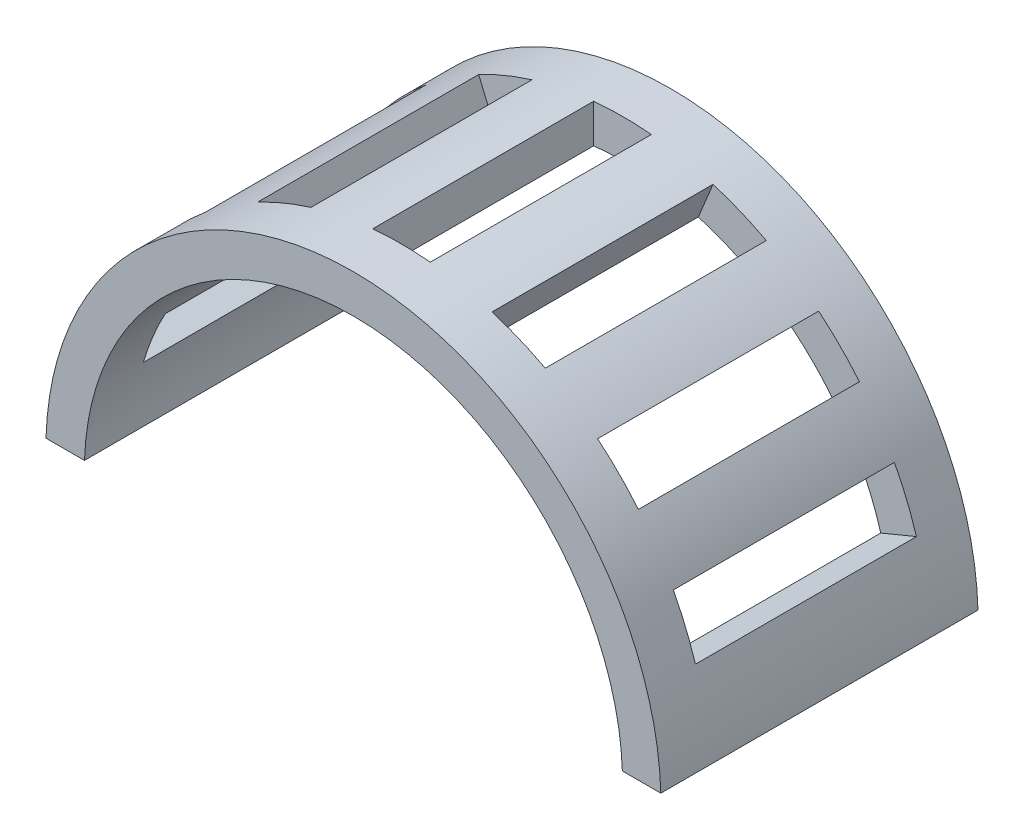
ISO-10303-21;
HEADER;
FILE_DESCRIPTION(('STEP AP214'),'2;1');
FILE_NAME('part.step','',(''),(''),'','','');
FILE_SCHEMA(('AUTOMOTIVE_DESIGN { 1 0 10303 214 1 1 1 1 }'));
ENDSEC;
DATA;
#1=APPLICATION_CONTEXT('core data for automotive mechanical design processes');
#2=APPLICATION_PROTOCOL_DEFINITION('international standard','automotive_design',2000,#1);
#3=PRODUCT_CONTEXT('',#1,'mechanical');
#4=PRODUCT('Part','Part','',(#3));
#5=PRODUCT_RELATED_PRODUCT_CATEGORY('part','',(#4));
#6=PRODUCT_DEFINITION_FORMATION('','',#4);
#7=PRODUCT_DEFINITION_CONTEXT('part definition',#1,'design');
#8=PRODUCT_DEFINITION('design','',#6,#7);
#9=PRODUCT_DEFINITION_SHAPE('','',#8);
#10=(LENGTH_UNIT() NAMED_UNIT(*) SI_UNIT(.MILLI.,.METRE.));
#11=(NAMED_UNIT(*) PLANE_ANGLE_UNIT() SI_UNIT($,.RADIAN.));
#12=(NAMED_UNIT(*) SI_UNIT($,.STERADIAN.) SOLID_ANGLE_UNIT());
#13=UNCERTAINTY_MEASURE_WITH_UNIT(LENGTH_MEASURE(1.E-05),#10,'distance_accuracy_value','');
#14=(GEOMETRIC_REPRESENTATION_CONTEXT(3) GLOBAL_UNCERTAINTY_ASSIGNED_CONTEXT((#13)) GLOBAL_UNIT_ASSIGNED_CONTEXT((#10,
#11,#12)) REPRESENTATION_CONTEXT('',''));
#15=CARTESIAN_POINT('',(0.,0.,0.));
#16=DIRECTION('',(0.,0.,1.));
#17=DIRECTION('',(1.,0.,0.));
#18=AXIS2_PLACEMENT_3D('',#15,#16,#17);
#19=CARTESIAN_POINT('',(0.,0.,16.5));
#20=DIRECTION('',(0.,0.,-1.));
#21=DIRECTION('',(-1.,0.,0.));
#22=AXIS2_PLACEMENT_3D('',#19,#20,#21);
#23=CYLINDRICAL_SURFACE('',#22,16.);
#24=CARTESIAN_POINT('',(0.,0.,0.));
#25=DIRECTION('',(0.,0.,1.));
#26=DIRECTION('',(1.,0.,0.));
#27=AXIS2_PLACEMENT_3D('',#24,#25,#26);
#28=CIRCLE('',#27,16.);
#29=CARTESIAN_POINT('',(15.9921855917195,0.5,0.));
#30=VERTEX_POINT('',#29);
#31=CARTESIAN_POINT('',(-15.9921855917195,0.5,0.));
#32=VERTEX_POINT('',#31);
#33=EDGE_CURVE('E454',#30,#32,#28,.T.);
#34=ORIENTED_EDGE('',*,*,#33,.T.);
#35=DIRECTION('',(0.,0.,-1.));
#36=VECTOR('',#35,1.);
#37=CARTESIAN_POINT('',(-15.9921855917195,0.5,16.5));
#38=LINE('',#37,#36);
#39=CARTESIAN_POINT('',(-15.9921855917195,0.5,16.5));
#40=VERTEX_POINT('',#39);
#41=EDGE_CURVE('E11',#40,#32,#38,.T.);
#42=ORIENTED_EDGE('',*,*,#41,.F.);
#43=CARTESIAN_POINT('',(0.,0.,16.5));
#44=DIRECTION('',(0.,0.,1.));
#45=DIRECTION('',(1.,0.,0.));
#46=AXIS2_PLACEMENT_3D('',#43,#44,#45);
#47=CIRCLE('',#46,16.);
#48=CARTESIAN_POINT('',(15.9921855917195,0.5,16.5));
#49=VERTEX_POINT('',#48);
#50=EDGE_CURVE('E464',#49,#40,#47,.T.);
#51=ORIENTED_EDGE('',*,*,#50,.F.);
#52=DIRECTION('',(0.,0.,-1.));
#53=VECTOR('',#52,1.);
#54=CARTESIAN_POINT('',(15.9921855917195,0.5,16.5));
#55=LINE('',#54,#53);
#56=EDGE_CURVE('E474',#49,#30,#55,.T.);
#57=ORIENTED_EDGE('',*,*,#56,.T.);
#58=EDGE_LOOP('',(#34,#42,#51,#57));
#59=FACE_BOUND('',#58,.T.);
#60=DIRECTION('',(0.,0.,1.));
#61=VECTOR('',#60,1.);
#62=CARTESIAN_POINT('',(-12.3245404978485,10.2032201542891,2.5));
#63=LINE('',#62,#61);
#64=CARTESIAN_POINT('',(-12.3245404978485,10.2032201542891,2.5));
#65=VERTEX_POINT('',#64);
#66=CARTESIAN_POINT('',(-12.3245404978485,10.2032201542891,14.));
#67=VERTEX_POINT('',#66);
#68=EDGE_CURVE('E292',#65,#67,#63,.T.);
#69=ORIENTED_EDGE('',*,*,#68,.F.);
#70=CARTESIAN_POINT('',(0.,0.,2.5));
#71=DIRECTION('',(0.,0.,1.));
#72=DIRECTION('',(0.707106781186556,0.707106781186539,0.));
#73=AXIS2_PLACEMENT_3D('',#70,#71,#72);
#74=CIRCLE('',#73,16.);
#75=CARTESIAN_POINT('',(-10.2032201542888,12.3245404978488,2.5));
#76=VERTEX_POINT('',#75);
#77=EDGE_CURVE('E287',#76,#65,#74,.T.);
#78=ORIENTED_EDGE('',*,*,#77,.F.);
#79=DIRECTION('',(0.,0.,1.));
#80=VECTOR('',#79,1.);
#81=CARTESIAN_POINT('',(-10.2032201542888,12.3245404978488,2.5));
#82=LINE('',#81,#80);
#83=CARTESIAN_POINT('',(-10.2032201542888,12.3245404978488,14.));
#84=VERTEX_POINT('',#83);
#85=EDGE_CURVE('E281',#76,#84,#82,.T.);
#86=ORIENTED_EDGE('',*,*,#85,.T.);
#87=CARTESIAN_POINT('',(0.,0.,14.));
#88=DIRECTION('',(0.,0.,1.));
#89=DIRECTION('',(0.707106781186556,0.707106781186539,0.));
#90=AXIS2_PLACEMENT_3D('',#87,#88,#89);
#91=CIRCLE('',#90,16.);
#92=EDGE_CURVE('E263',#84,#67,#91,.T.);
#93=ORIENTED_EDGE('',*,*,#92,.T.);
#94=EDGE_LOOP('',(#69,#78,#86,#93));
#95=FACE_BOUND('',#94,.T.);
#96=DIRECTION('',(0.,0.,1.));
#97=VECTOR('',#96,1.);
#98=CARTESIAN_POINT('',(14.1429437262935,7.48178740374881,2.5));
#99=LINE('',#98,#97);
#100=CARTESIAN_POINT('',(14.1429437262935,7.48178740374881,2.5));
#101=VERTEX_POINT('',#100);
#102=CARTESIAN_POINT('',(14.1429437262935,7.48178740374881,14.));
#103=VERTEX_POINT('',#102);
#104=EDGE_CURVE('E354',#101,#103,#99,.T.);
#105=ORIENTED_EDGE('',*,*,#104,.F.);
#106=CARTESIAN_POINT('',(0.,0.,2.5));
#107=DIRECTION('',(0.,0.,1.));
#108=DIRECTION('',(0.382683432365087,-0.923879532511288,0.));
#109=AXIS2_PLACEMENT_3D('',#106,#107,#108);
#110=CIRCLE('',#109,16.);
#111=CARTESIAN_POINT('',(15.2909940233888,4.71014880621494,2.5));
#112=VERTEX_POINT('',#111);
#113=EDGE_CURVE('E349',#112,#101,#110,.T.);
#114=ORIENTED_EDGE('',*,*,#113,.F.);
#115=DIRECTION('',(0.,0.,1.));
#116=VECTOR('',#115,1.);
#117=CARTESIAN_POINT('',(15.2909940233888,4.71014880621494,2.5));
#118=LINE('',#117,#116);
#119=CARTESIAN_POINT('',(15.2909940233888,4.71014880621494,14.));
#120=VERTEX_POINT('',#119);
#121=EDGE_CURVE('E343',#112,#120,#118,.T.);
#122=ORIENTED_EDGE('',*,*,#121,.T.);
#123=CARTESIAN_POINT('',(0.,0.,14.));
#124=DIRECTION('',(0.,0.,1.));
#125=DIRECTION('',(0.382683432365087,-0.923879532511288,0.));
#126=AXIS2_PLACEMENT_3D('',#123,#124,#125);
#127=CIRCLE('',#126,16.);
#128=EDGE_CURVE('E330',#120,#103,#127,.T.);
#129=ORIENTED_EDGE('',*,*,#128,.T.);
#130=EDGE_LOOP('',(#105,#114,#122,#129));
#131=FACE_BOUND('',#130,.T.);
#132=DIRECTION('',(0.,0.,1.));
#133=VECTOR('',#132,1.);
#134=CARTESIAN_POINT('',(4.710148806215,15.2909940233888,2.5));
#135=LINE('',#134,#133);
#136=CARTESIAN_POINT('',(4.710148806215,15.2909940233888,2.5));
#137=VERTEX_POINT('',#136);
#138=CARTESIAN_POINT('',(4.710148806215,15.2909940233888,14.));
#139=VERTEX_POINT('',#138);
#140=EDGE_CURVE('E416',#137,#139,#135,.T.);
#141=ORIENTED_EDGE('',*,*,#140,.F.);
#142=CARTESIAN_POINT('',(0.,0.,2.5));
#143=DIRECTION('',(0.,0.,1.));
#144=DIRECTION('',(0.923879532511286,-0.382683432365091,0.));
#145=AXIS2_PLACEMENT_3D('',#142,#143,#144);
#146=CIRCLE('',#145,16.);
#147=CARTESIAN_POINT('',(7.48178740374886,14.1429437262935,2.5));
#148=VERTEX_POINT('',#147);
#149=EDGE_CURVE('E411',#148,#137,#146,.T.);
#150=ORIENTED_EDGE('',*,*,#149,.F.);
#151=DIRECTION('',(0.,0.,1.));
#152=VECTOR('',#151,1.);
#153=CARTESIAN_POINT('',(7.48178740374886,14.1429437262935,2.5));
#154=LINE('',#153,#152);
#155=CARTESIAN_POINT('',(7.48178740374886,14.1429437262935,14.));
#156=VERTEX_POINT('',#155);
#157=EDGE_CURVE('E405',#148,#156,#154,.T.);
#158=ORIENTED_EDGE('',*,*,#157,.T.);
#159=CARTESIAN_POINT('',(0.,0.,14.));
#160=DIRECTION('',(0.,0.,1.));
#161=DIRECTION('',(0.923879532511286,-0.382683432365091,0.));
#162=AXIS2_PLACEMENT_3D('',#159,#160,#161);
#163=CIRCLE('',#162,16.);
#164=EDGE_CURVE('E392',#156,#139,#163,.T.);
#165=ORIENTED_EDGE('',*,*,#164,.T.);
#166=EDGE_LOOP('',(#141,#150,#158,#165));
#167=FACE_BOUND('',#166,.T.);
#168=CARTESIAN_POINT('',(0.,0.,2.5));
#169=DIRECTION('',(0.,0.,1.));
#170=DIRECTION('',(1.,0.,0.));
#171=AXIS2_PLACEMENT_3D('',#168,#169,#170);
#172=CIRCLE('',#171,16.);
#173=CARTESIAN_POINT('',(1.5,15.929532322074,2.5));
#174=VERTEX_POINT('',#173);
#175=CARTESIAN_POINT('',(-1.5,15.929532322074,2.5));
#176=VERTEX_POINT('',#175);
#177=EDGE_CURVE('E436',#174,#176,#172,.T.);
#178=ORIENTED_EDGE('',*,*,#177,.F.);
#179=DIRECTION('',(0.,0.,1.));
#180=VECTOR('',#179,1.);
#181=CARTESIAN_POINT('',(1.5,15.929532322074,2.5));
#182=LINE('',#181,#180);
#183=CARTESIAN_POINT('',(1.5,15.929532322074,14.));
#184=VERTEX_POINT('',#183);
#185=EDGE_CURVE('E445',#174,#184,#182,.T.);
#186=ORIENTED_EDGE('',*,*,#185,.T.);
#187=CARTESIAN_POINT('',(0.,0.,14.));
#188=DIRECTION('',(0.,0.,1.));
#189=DIRECTION('',(1.,0.,0.));
#190=AXIS2_PLACEMENT_3D('',#187,#188,#189);
#191=CIRCLE('',#190,16.);
#192=CARTESIAN_POINT('',(-1.5,15.929532322074,14.));
#193=VERTEX_POINT('',#192);
#194=EDGE_CURVE('E425',#184,#193,#191,.T.);
#195=ORIENTED_EDGE('',*,*,#194,.T.);
#196=DIRECTION('',(0.,0.,1.));
#197=VECTOR('',#196,1.);
#198=CARTESIAN_POINT('',(-1.5,15.929532322074,2.5));
#199=LINE('',#198,#197);
#200=EDGE_CURVE('E448',#176,#193,#199,.T.);
#201=ORIENTED_EDGE('',*,*,#200,.F.);
#202=EDGE_LOOP('',(#178,#186,#195,#201));
#203=FACE_BOUND('',#202,.T.);
#204=DIRECTION('',(0.,0.,1.));
#205=VECTOR('',#204,1.);
#206=CARTESIAN_POINT('',(10.203220154289,12.3245404978486,2.5));
#207=LINE('',#206,#205);
#208=CARTESIAN_POINT('',(10.203220154289,12.3245404978486,2.5));
#209=VERTEX_POINT('',#208);
#210=CARTESIAN_POINT('',(10.203220154289,12.3245404978486,14.));
#211=VERTEX_POINT('',#210);
#212=EDGE_CURVE('E385',#209,#211,#207,.T.);
#213=ORIENTED_EDGE('',*,*,#212,.F.);
#214=CARTESIAN_POINT('',(0.,0.,2.5));
#215=DIRECTION('',(0.,0.,1.));
#216=DIRECTION('',(0.707106781186546,-0.707106781186549,0.));
#217=AXIS2_PLACEMENT_3D('',#214,#215,#216);
#218=CIRCLE('',#217,16.);
#219=CARTESIAN_POINT('',(12.3245404978487,10.203220154289,2.5));
#220=VERTEX_POINT('',#219);
#221=EDGE_CURVE('E380',#220,#209,#218,.T.);
#222=ORIENTED_EDGE('',*,*,#221,.F.);
#223=DIRECTION('',(0.,0.,1.));
#224=VECTOR('',#223,1.);
#225=CARTESIAN_POINT('',(12.3245404978487,10.203220154289,2.5));
#226=LINE('',#225,#224);
#227=CARTESIAN_POINT('',(12.3245404978487,10.203220154289,14.));
#228=VERTEX_POINT('',#227);
#229=EDGE_CURVE('E374',#220,#228,#226,.T.);
#230=ORIENTED_EDGE('',*,*,#229,.T.);
#231=CARTESIAN_POINT('',(0.,0.,14.));
#232=DIRECTION('',(0.,0.,1.));
#233=DIRECTION('',(0.707106781186546,-0.707106781186549,0.));
#234=AXIS2_PLACEMENT_3D('',#231,#232,#233);
#235=CIRCLE('',#234,16.);
#236=EDGE_CURVE('E361',#228,#211,#235,.T.);
#237=ORIENTED_EDGE('',*,*,#236,.T.);
#238=EDGE_LOOP('',(#213,#222,#230,#237));
#239=FACE_BOUND('',#238,.T.);
#240=DIRECTION('',(0.,0.,1.));
#241=VECTOR('',#240,1.);
#242=CARTESIAN_POINT('',(-15.2909940233887,4.71014880621515,2.5));
#243=LINE('',#242,#241);
#244=CARTESIAN_POINT('',(-15.2909940233887,4.71014880621515,2.5));
#245=VERTEX_POINT('',#244);
#246=CARTESIAN_POINT('',(-15.2909940233887,4.71014880621515,14.));
#247=VERTEX_POINT('',#246);
#248=EDGE_CURVE('E323',#245,#247,#243,.T.);
#249=ORIENTED_EDGE('',*,*,#248,.F.);
#250=CARTESIAN_POINT('',(0.,0.,2.5));
#251=DIRECTION('',(0.,0.,1.));
#252=DIRECTION('',(0.3826834323651,0.923879532511283,0.));
#253=AXIS2_PLACEMENT_3D('',#250,#251,#252);
#254=CIRCLE('',#253,16.);
#255=CARTESIAN_POINT('',(-14.1429437262934,7.481787403749,2.5));
#256=VERTEX_POINT('',#255);
#257=EDGE_CURVE('E318',#256,#245,#254,.T.);
#258=ORIENTED_EDGE('',*,*,#257,.F.);
#259=DIRECTION('',(0.,0.,1.));
#260=VECTOR('',#259,1.);
#261=CARTESIAN_POINT('',(-14.1429437262934,7.481787403749,2.5));
#262=LINE('',#261,#260);
#263=CARTESIAN_POINT('',(-14.1429437262934,7.481787403749,14.));
#264=VERTEX_POINT('',#263);
#265=EDGE_CURVE('E312',#256,#264,#262,.T.);
#266=ORIENTED_EDGE('',*,*,#265,.T.);
#267=CARTESIAN_POINT('',(0.,0.,14.));
#268=DIRECTION('',(0.,0.,1.));
#269=DIRECTION('',(0.3826834323651,0.923879532511283,0.));
#270=AXIS2_PLACEMENT_3D('',#267,#268,#269);
#271=CIRCLE('',#270,16.);
#272=EDGE_CURVE('E299',#264,#247,#271,.T.);
#273=ORIENTED_EDGE('',*,*,#272,.T.);
#274=EDGE_LOOP('',(#249,#258,#266,#273));
#275=FACE_BOUND('',#274,.T.);
#276=DIRECTION('',(0.,0.,1.));
#277=VECTOR('',#276,1.);
#278=CARTESIAN_POINT('',(-7.48178740374865,14.1429437262936,2.5));
#279=LINE('',#278,#277);
#280=CARTESIAN_POINT('',(-7.48178740374865,14.1429437262936,2.5));
#281=VERTEX_POINT('',#280);
#282=CARTESIAN_POINT('',(-7.48178740374865,14.1429437262936,14.));
#283=VERTEX_POINT('',#282);
#284=EDGE_CURVE('E48',#281,#283,#279,.T.);
#285=ORIENTED_EDGE('',*,*,#284,.F.);
#286=CARTESIAN_POINT('',(0.,0.,2.5));
#287=DIRECTION('',(0.,0.,1.));
#288=DIRECTION('',(0.923879532511292,0.382683432365077,0.));
#289=AXIS2_PLACEMENT_3D('',#286,#287,#288);
#290=CIRCLE('',#289,16.);
#291=CARTESIAN_POINT('',(-4.71014880621477,15.2909940233888,2.5));
#292=VERTEX_POINT('',#291);
#293=EDGE_CURVE('E521',#292,#281,#290,.T.);
#294=ORIENTED_EDGE('',*,*,#293,.F.);
#295=DIRECTION('',(0.,0.,1.));
#296=VECTOR('',#295,1.);
#297=CARTESIAN_POINT('',(-4.71014880621477,15.2909940233888,2.5));
#298=LINE('',#297,#296);
#299=CARTESIAN_POINT('',(-4.71014880621477,15.2909940233888,14.));
#300=VERTEX_POINT('',#299);
#301=EDGE_CURVE('E523',#292,#300,#298,.T.);
#302=ORIENTED_EDGE('',*,*,#301,.T.);
#303=CARTESIAN_POINT('',(0.,0.,14.));
#304=DIRECTION('',(0.,0.,1.));
#305=DIRECTION('',(0.923879532511292,0.382683432365077,0.));
#306=AXIS2_PLACEMENT_3D('',#303,#304,#305);
#307=CIRCLE('',#306,16.);
#308=EDGE_CURVE('E251',#300,#283,#307,.T.);
#309=ORIENTED_EDGE('',*,*,#308,.T.);
#310=EDGE_LOOP('',(#285,#294,#302,#309));
#311=FACE_BOUND('',#310,.T.);
#312=ADVANCED_FACE('F33',(#59,#95,#131,#167,#203,#239,#275,#311),#23,.T.);
#313=CARTESIAN_POINT('',(0.,0.,16.5));
#314=DIRECTION('',(0.,0.,-1.));
#315=DIRECTION('',(-1.,0.,0.));
#316=AXIS2_PLACEMENT_3D('',#313,#314,#315);
#317=CYLINDRICAL_SURFACE('',#316,14.);
#318=DIRECTION('',(0.,0.,-1.));
#319=VECTOR('',#318,1.);
#320=CARTESIAN_POINT('',(-13.9910685796332,0.500000000000001,16.5));
#321=LINE('',#320,#319);
#322=CARTESIAN_POINT('',(-13.9910685796332,0.500000000000001,16.5));
#323=VERTEX_POINT('',#322);
#324=CARTESIAN_POINT('',(-13.9910685796332,0.500000000000001,0.));
#325=VERTEX_POINT('',#324);
#326=EDGE_CURVE('E41',#323,#325,#321,.T.);
#327=ORIENTED_EDGE('',*,*,#326,.T.);
#328=CARTESIAN_POINT('',(0.,0.,0.));
#329=DIRECTION('',(0.,0.,1.));
#330=DIRECTION('',(1.,0.,0.));
#331=AXIS2_PLACEMENT_3D('',#328,#329,#330);
#332=CIRCLE('',#331,14.);
#333=CARTESIAN_POINT('',(13.9910685796332,0.5,0.));
#334=VERTEX_POINT('',#333);
#335=EDGE_CURVE('E459',#334,#325,#332,.T.);
#336=ORIENTED_EDGE('',*,*,#335,.F.);
#337=DIRECTION('',(0.,0.,-1.));
#338=VECTOR('',#337,1.);
#339=CARTESIAN_POINT('',(13.9910685796332,0.5,16.5));
#340=LINE('',#339,#338);
#341=CARTESIAN_POINT('',(13.9910685796332,0.5,16.5));
#342=VERTEX_POINT('',#341);
#343=EDGE_CURVE('E476',#342,#334,#340,.T.);
#344=ORIENTED_EDGE('',*,*,#343,.F.);
#345=CARTESIAN_POINT('',(0.,0.,16.5));
#346=DIRECTION('',(0.,0.,1.));
#347=DIRECTION('',(1.,0.,0.));
#348=AXIS2_PLACEMENT_3D('',#345,#346,#347);
#349=CIRCLE('',#348,14.);
#350=EDGE_CURVE('E469',#342,#323,#349,.T.);
#351=ORIENTED_EDGE('',*,*,#350,.T.);
#352=EDGE_LOOP('',(#327,#336,#344,#351));
#353=FACE_BOUND('',#352,.T.);
#354=CARTESIAN_POINT('',(0.,0.,2.5));
#355=DIRECTION('',(0.,0.,1.));
#356=DIRECTION('',(0.707106781186556,0.707106781186539,0.));
#357=AXIS2_PLACEMENT_3D('',#354,#355,#356);
#358=CIRCLE('',#357,14.);
#359=CARTESIAN_POINT('',(-8.78184967073481,10.9031700142947,2.5));
#360=VERTEX_POINT('',#359);
#361=CARTESIAN_POINT('',(-10.9031700142945,8.78184967073507,2.5));
#362=VERTEX_POINT('',#361);
#363=EDGE_CURVE('E284',#360,#362,#358,.T.);
#364=ORIENTED_EDGE('',*,*,#363,.T.);
#365=DIRECTION('',(0.,0.,1.));
#366=VECTOR('',#365,1.);
#367=CARTESIAN_POINT('',(-10.9031700142945,8.78184967073507,2.5));
#368=LINE('',#367,#366);
#369=CARTESIAN_POINT('',(-10.9031700142945,8.78184967073507,14.));
#370=VERTEX_POINT('',#369);
#371=EDGE_CURVE('E294',#362,#370,#368,.T.);
#372=ORIENTED_EDGE('',*,*,#371,.T.);
#373=CARTESIAN_POINT('',(0.,0.,14.));
#374=DIRECTION('',(0.,0.,1.));
#375=DIRECTION('',(0.707106781186556,0.707106781186539,0.));
#376=AXIS2_PLACEMENT_3D('',#373,#374,#375);
#377=CIRCLE('',#376,14.);
#378=CARTESIAN_POINT('',(-8.78184967073481,10.9031700142947,14.));
#379=VERTEX_POINT('',#378);
#380=EDGE_CURVE('E261',#379,#370,#377,.T.);
#381=ORIENTED_EDGE('',*,*,#380,.F.);
#382=DIRECTION('',(0.,0.,1.));
#383=VECTOR('',#382,1.);
#384=CARTESIAN_POINT('',(-8.78184967073481,10.9031700142947,2.5));
#385=LINE('',#384,#383);
#386=EDGE_CURVE('E279',#360,#379,#385,.T.);
#387=ORIENTED_EDGE('',*,*,#386,.F.);
#388=EDGE_LOOP('',(#364,#372,#381,#387));
#389=FACE_BOUND('',#388,.T.);
#390=CARTESIAN_POINT('',(0.,0.,2.5));
#391=DIRECTION('',(0.,0.,1.));
#392=DIRECTION('',(0.382683432365087,-0.923879532511288,0.));
#393=AXIS2_PLACEMENT_3D('',#390,#391,#392);
#394=CIRCLE('',#393,14.);
#395=CARTESIAN_POINT('',(13.4338839902087,3.94090864365258,2.5));
#396=VERTEX_POINT('',#395);
#397=CARTESIAN_POINT('',(12.2858336931134,6.71254724118645,2.5));
#398=VERTEX_POINT('',#397);
#399=EDGE_CURVE('E346',#396,#398,#394,.T.);
#400=ORIENTED_EDGE('',*,*,#399,.T.);
#401=DIRECTION('',(0.,0.,1.));
#402=VECTOR('',#401,1.);
#403=CARTESIAN_POINT('',(12.2858336931134,6.71254724118645,2.5));
#404=LINE('',#403,#402);
#405=CARTESIAN_POINT('',(12.2858336931134,6.71254724118645,14.));
#406=VERTEX_POINT('',#405);
#407=EDGE_CURVE('E356',#398,#406,#404,.T.);
#408=ORIENTED_EDGE('',*,*,#407,.T.);
#409=CARTESIAN_POINT('',(0.,0.,14.));
#410=DIRECTION('',(0.,0.,1.));
#411=DIRECTION('',(0.382683432365087,-0.923879532511288,0.));
#412=AXIS2_PLACEMENT_3D('',#409,#410,#411);
#413=CIRCLE('',#412,14.);
#414=CARTESIAN_POINT('',(13.4338839902087,3.94090864365258,14.));
#415=VERTEX_POINT('',#414);
#416=EDGE_CURVE('E328',#415,#406,#413,.T.);
#417=ORIENTED_EDGE('',*,*,#416,.F.);
#418=DIRECTION('',(0.,0.,1.));
#419=VECTOR('',#418,1.);
#420=CARTESIAN_POINT('',(13.4338839902087,3.94090864365258,2.5));
#421=LINE('',#420,#419);
#422=EDGE_CURVE('E341',#396,#415,#421,.T.);
#423=ORIENTED_EDGE('',*,*,#422,.F.);
#424=EDGE_LOOP('',(#400,#408,#417,#423));
#425=FACE_BOUND('',#424,.T.);
#426=CARTESIAN_POINT('',(0.,0.,2.5));
#427=DIRECTION('',(0.,0.,1.));
#428=DIRECTION('',(0.923879532511286,-0.382683432365091,0.));
#429=AXIS2_PLACEMENT_3D('',#426,#427,#428);
#430=CIRCLE('',#429,14.);
#431=CARTESIAN_POINT('',(6.71254724118649,12.2858336931134,2.5));
#432=VERTEX_POINT('',#431);
#433=CARTESIAN_POINT('',(3.94090864365263,13.4338839902086,2.5));
#434=VERTEX_POINT('',#433);
#435=EDGE_CURVE('E408',#432,#434,#430,.T.);
#436=ORIENTED_EDGE('',*,*,#435,.T.);
#437=DIRECTION('',(0.,0.,1.));
#438=VECTOR('',#437,1.);
#439=CARTESIAN_POINT('',(3.94090864365263,13.4338839902086,2.5));
#440=LINE('',#439,#438);
#441=CARTESIAN_POINT('',(3.94090864365263,13.4338839902086,14.));
#442=VERTEX_POINT('',#441);
#443=EDGE_CURVE('E418',#434,#442,#440,.T.);
#444=ORIENTED_EDGE('',*,*,#443,.T.);
#445=CARTESIAN_POINT('',(0.,0.,14.));
#446=DIRECTION('',(0.,0.,1.));
#447=DIRECTION('',(0.923879532511286,-0.382683432365091,0.));
#448=AXIS2_PLACEMENT_3D('',#445,#446,#447);
#449=CIRCLE('',#448,14.);
#450=CARTESIAN_POINT('',(6.71254724118649,12.2858336931134,14.));
#451=VERTEX_POINT('',#450);
#452=EDGE_CURVE('E390',#451,#442,#449,.T.);
#453=ORIENTED_EDGE('',*,*,#452,.F.);
#454=DIRECTION('',(0.,0.,1.));
#455=VECTOR('',#454,1.);
#456=CARTESIAN_POINT('',(6.71254724118649,12.2858336931134,2.5));
#457=LINE('',#456,#455);
#458=EDGE_CURVE('E403',#432,#451,#457,.T.);
#459=ORIENTED_EDGE('',*,*,#458,.F.);
#460=EDGE_LOOP('',(#436,#444,#453,#459));
#461=FACE_BOUND('',#460,.T.);
#462=DIRECTION('',(0.,0.,1.));
#463=VECTOR('',#462,1.);
#464=CARTESIAN_POINT('',(1.5,13.9194109070751,2.5));
#465=LINE('',#464,#463);
#466=CARTESIAN_POINT('',(1.5,13.9194109070751,2.5));
#467=VERTEX_POINT('',#466);
#468=CARTESIAN_POINT('',(1.5,13.9194109070751,14.));
#469=VERTEX_POINT('',#468);
#470=EDGE_CURVE('E442',#467,#469,#465,.T.);
#471=ORIENTED_EDGE('',*,*,#470,.F.);
#472=CARTESIAN_POINT('',(0.,0.,2.5));
#473=DIRECTION('',(0.,0.,1.));
#474=DIRECTION('',(1.,0.,0.));
#475=AXIS2_PLACEMENT_3D('',#472,#473,#474);
#476=CIRCLE('',#475,14.);
#477=CARTESIAN_POINT('',(-1.5,13.9194109070751,2.5));
#478=VERTEX_POINT('',#477);
#479=EDGE_CURVE('E431',#467,#478,#476,.T.);
#480=ORIENTED_EDGE('',*,*,#479,.T.);
#481=DIRECTION('',(0.,0.,1.));
#482=VECTOR('',#481,1.);
#483=CARTESIAN_POINT('',(-1.5,13.9194109070751,2.5));
#484=LINE('',#483,#482);
#485=CARTESIAN_POINT('',(-1.5,13.9194109070751,14.));
#486=VERTEX_POINT('',#485);
#487=EDGE_CURVE('E451',#478,#486,#484,.T.);
#488=ORIENTED_EDGE('',*,*,#487,.T.);
#489=CARTESIAN_POINT('',(0.,0.,14.));
#490=DIRECTION('',(0.,0.,1.));
#491=DIRECTION('',(1.,0.,0.));
#492=AXIS2_PLACEMENT_3D('',#489,#490,#491);
#493=CIRCLE('',#492,14.);
#494=EDGE_CURVE('E421',#469,#486,#493,.T.);
#495=ORIENTED_EDGE('',*,*,#494,.F.);
#496=EDGE_LOOP('',(#471,#480,#488,#495));
#497=FACE_BOUND('',#496,.T.);
#498=CARTESIAN_POINT('',(0.,0.,2.5));
#499=DIRECTION('',(0.,0.,1.));
#500=DIRECTION('',(0.707106781186546,-0.707106781186549,0.));
#501=AXIS2_PLACEMENT_3D('',#498,#499,#500);
#502=CIRCLE('',#501,14.);
#503=CARTESIAN_POINT('',(10.9031700142946,8.78184967073492,2.5));
#504=VERTEX_POINT('',#503);
#505=CARTESIAN_POINT('',(8.78184967073496,10.9031700142946,2.5));
#506=VERTEX_POINT('',#505);
#507=EDGE_CURVE('E377',#504,#506,#502,.T.);
#508=ORIENTED_EDGE('',*,*,#507,.T.);
#509=DIRECTION('',(0.,0.,1.));
#510=VECTOR('',#509,1.);
#511=CARTESIAN_POINT('',(8.78184967073496,10.9031700142946,2.5));
#512=LINE('',#511,#510);
#513=CARTESIAN_POINT('',(8.78184967073496,10.9031700142946,14.));
#514=VERTEX_POINT('',#513);
#515=EDGE_CURVE('E387',#506,#514,#512,.T.);
#516=ORIENTED_EDGE('',*,*,#515,.T.);
#517=CARTESIAN_POINT('',(0.,0.,14.));
#518=DIRECTION('',(0.,0.,1.));
#519=DIRECTION('',(0.707106781186546,-0.707106781186549,0.));
#520=AXIS2_PLACEMENT_3D('',#517,#518,#519);
#521=CIRCLE('',#520,14.);
#522=CARTESIAN_POINT('',(10.9031700142946,8.78184967073492,14.));
#523=VERTEX_POINT('',#522);
#524=EDGE_CURVE('E359',#523,#514,#521,.T.);
#525=ORIENTED_EDGE('',*,*,#524,.F.);
#526=DIRECTION('',(0.,0.,1.));
#527=VECTOR('',#526,1.);
#528=CARTESIAN_POINT('',(10.9031700142946,8.78184967073492,2.5));
#529=LINE('',#528,#527);
#530=EDGE_CURVE('E372',#504,#523,#529,.T.);
#531=ORIENTED_EDGE('',*,*,#530,.F.);
#532=EDGE_LOOP('',(#508,#516,#525,#531));
#533=FACE_BOUND('',#532,.T.);
#534=CARTESIAN_POINT('',(0.,0.,2.5));
#535=DIRECTION('',(0.,0.,1.));
#536=DIRECTION('',(0.3826834323651,0.923879532511283,0.));
#537=AXIS2_PLACEMENT_3D('',#534,#535,#536);
#538=CIRCLE('',#537,14.);
#539=CARTESIAN_POINT('',(-12.2858336931133,6.71254724118661,2.5));
#540=VERTEX_POINT('',#539);
#541=CARTESIAN_POINT('',(-13.4338839902086,3.94090864365277,2.5));
#542=VERTEX_POINT('',#541);
#543=EDGE_CURVE('E315',#540,#542,#538,.T.);
#544=ORIENTED_EDGE('',*,*,#543,.T.);
#545=DIRECTION('',(0.,0.,1.));
#546=VECTOR('',#545,1.);
#547=CARTESIAN_POINT('',(-13.4338839902086,3.94090864365277,2.5));
#548=LINE('',#547,#546);
#549=CARTESIAN_POINT('',(-13.4338839902086,3.94090864365277,14.));
#550=VERTEX_POINT('',#549);
#551=EDGE_CURVE('E325',#542,#550,#548,.T.);
#552=ORIENTED_EDGE('',*,*,#551,.T.);
#553=CARTESIAN_POINT('',(0.,0.,14.));
#554=DIRECTION('',(0.,0.,1.));
#555=DIRECTION('',(0.3826834323651,0.923879532511283,0.));
#556=AXIS2_PLACEMENT_3D('',#553,#554,#555);
#557=CIRCLE('',#556,14.);
#558=CARTESIAN_POINT('',(-12.2858336931133,6.71254724118661,14.));
#559=VERTEX_POINT('',#558);
#560=EDGE_CURVE('E297',#559,#550,#557,.T.);
#561=ORIENTED_EDGE('',*,*,#560,.F.);
#562=DIRECTION('',(0.,0.,1.));
#563=VECTOR('',#562,1.);
#564=CARTESIAN_POINT('',(-12.2858336931133,6.71254724118661,2.5));
#565=LINE('',#564,#563);
#566=EDGE_CURVE('E310',#540,#559,#565,.T.);
#567=ORIENTED_EDGE('',*,*,#566,.F.);
#568=EDGE_LOOP('',(#544,#552,#561,#567));
#569=FACE_BOUND('',#568,.T.);
#570=CARTESIAN_POINT('',(0.,0.,2.5));
#571=DIRECTION('',(0.,0.,1.));
#572=DIRECTION('',(0.923879532511292,0.382683432365077,0.));
#573=AXIS2_PLACEMENT_3D('',#570,#571,#572);
#574=CIRCLE('',#573,14.);
#575=CARTESIAN_POINT('',(-3.94090864365244,13.4338839902087,2.5));
#576=VERTEX_POINT('',#575);
#577=CARTESIAN_POINT('',(-6.71254724118631,12.2858336931135,2.5));
#578=VERTEX_POINT('',#577);
#579=EDGE_CURVE('E260',#576,#578,#574,.T.);
#580=ORIENTED_EDGE('',*,*,#579,.T.);
#581=DIRECTION('',(0.,0.,1.));
#582=VECTOR('',#581,1.);
#583=CARTESIAN_POINT('',(-6.71254724118631,12.2858336931135,2.5));
#584=LINE('',#583,#582);
#585=CARTESIAN_POINT('',(-6.71254724118631,12.2858336931135,14.));
#586=VERTEX_POINT('',#585);
#587=EDGE_CURVE('E255',#578,#586,#584,.T.);
#588=ORIENTED_EDGE('',*,*,#587,.T.);
#589=CARTESIAN_POINT('',(0.,0.,14.));
#590=DIRECTION('',(0.,0.,1.));
#591=DIRECTION('',(0.923879532511292,0.382683432365077,0.));
#592=AXIS2_PLACEMENT_3D('',#589,#590,#591);
#593=CIRCLE('',#592,14.);
#594=CARTESIAN_POINT('',(-3.94090864365244,13.4338839902087,14.));
#595=VERTEX_POINT('',#594);
#596=EDGE_CURVE('E244',#595,#586,#593,.T.);
#597=ORIENTED_EDGE('',*,*,#596,.F.);
#598=DIRECTION('',(0.,0.,1.));
#599=VECTOR('',#598,1.);
#600=CARTESIAN_POINT('',(-3.94090864365244,13.4338839902087,2.5));
#601=LINE('',#600,#599);
#602=EDGE_CURVE('E56',#576,#595,#601,.T.);
#603=ORIENTED_EDGE('',*,*,#602,.F.);
#604=EDGE_LOOP('',(#580,#588,#597,#603));
#605=FACE_BOUND('',#604,.T.);
#606=ADVANCED_FACE('F258',(#353,#389,#425,#461,#497,#533,#569,#605),#317,.F.);
#607=CARTESIAN_POINT('',(-15.9921855917195,0.5,16.5));
#608=DIRECTION('',(0.,1.,0.));
#609=DIRECTION('',(0.,0.,1.));
#610=AXIS2_PLACEMENT_3D('',#607,#608,#609);
#611=PLANE('',#610);
#612=ORIENTED_EDGE('',*,*,#41,.T.);
#613=DIRECTION('',(1.,0.,0.));
#614=VECTOR('',#613,1.);
#615=CARTESIAN_POINT('',(-15.9921855917195,0.5,0.));
#616=LINE('',#615,#614);
#617=EDGE_CURVE('E456',#32,#325,#616,.T.);
#618=ORIENTED_EDGE('',*,*,#617,.T.);
#619=ORIENTED_EDGE('',*,*,#326,.F.);
#620=DIRECTION('',(1.,0.,0.));
#621=VECTOR('',#620,1.);
#622=CARTESIAN_POINT('',(-15.9921855917195,0.5,16.5));
#623=LINE('',#622,#621);
#624=EDGE_CURVE('E466',#40,#323,#623,.T.);
#625=ORIENTED_EDGE('',*,*,#624,.F.);
#626=EDGE_LOOP('',(#612,#618,#619,#625));
#627=FACE_BOUND('',#626,.T.);
#628=ADVANCED_FACE('F35',(#627),#611,.F.);
#629=CARTESIAN_POINT('',(13.9910685796332,0.5,16.5));
#630=DIRECTION('',(0.,1.,0.));
#631=DIRECTION('',(0.,0.,1.));
#632=AXIS2_PLACEMENT_3D('',#629,#630,#631);
#633=PLANE('',#632);
#634=ORIENTED_EDGE('',*,*,#343,.T.);
#635=DIRECTION('',(1.,0.,0.));
#636=VECTOR('',#635,1.);
#637=CARTESIAN_POINT('',(13.9910685796332,0.5,0.));
#638=LINE('',#637,#636);
#639=EDGE_CURVE('E461',#334,#30,#638,.T.);
#640=ORIENTED_EDGE('',*,*,#639,.T.);
#641=ORIENTED_EDGE('',*,*,#56,.F.);
#642=DIRECTION('',(1.,0.,0.));
#643=VECTOR('',#642,1.);
#644=CARTESIAN_POINT('',(13.9910685796332,0.5,16.5));
#645=LINE('',#644,#643);
#646=EDGE_CURVE('E471',#342,#49,#645,.T.);
#647=ORIENTED_EDGE('',*,*,#646,.F.);
#648=EDGE_LOOP('',(#634,#640,#641,#647));
#649=FACE_BOUND('',#648,.T.);
#650=ADVANCED_FACE('F492',(#649),#633,.F.);
#651=CARTESIAN_POINT('',(0.,0.,16.5));
#652=DIRECTION('',(0.,0.,1.));
#653=DIRECTION('',(1.,0.,0.));
#654=AXIS2_PLACEMENT_3D('',#651,#652,#653);
#655=PLANE('',#654);
#656=ORIENTED_EDGE('',*,*,#624,.T.);
#657=ORIENTED_EDGE('',*,*,#350,.F.);
#658=ORIENTED_EDGE('',*,*,#646,.T.);
#659=ORIENTED_EDGE('',*,*,#50,.T.);
#660=EDGE_LOOP('',(#656,#657,#658,#659));
#661=FACE_BOUND('',#660,.T.);
#662=ADVANCED_FACE('F496',(#661),#655,.T.);
#663=CARTESIAN_POINT('',(0.,0.,0.));
#664=DIRECTION('',(0.,0.,1.));
#665=DIRECTION('',(1.,0.,0.));
#666=AXIS2_PLACEMENT_3D('',#663,#664,#665);
#667=PLANE('',#666);
#668=ORIENTED_EDGE('',*,*,#617,.F.);
#669=ORIENTED_EDGE('',*,*,#33,.F.);
#670=ORIENTED_EDGE('',*,*,#639,.F.);
#671=ORIENTED_EDGE('',*,*,#335,.T.);
#672=EDGE_LOOP('',(#668,#669,#670,#671));
#673=FACE_BOUND('',#672,.T.);
#674=ADVANCED_FACE('F490',(#673),#667,.F.);
#675=CARTESIAN_POINT('',(-1.5,13.9194109070751,2.5));
#676=DIRECTION('',(1.,0.,0.));
#677=DIRECTION('',(0.,0.,-1.));
#678=AXIS2_PLACEMENT_3D('',#675,#676,#677);
#679=PLANE('',#678);
#680=ORIENTED_EDGE('',*,*,#200,.T.);
#681=DIRECTION('',(0.,1.,0.));
#682=VECTOR('',#681,1.);
#683=CARTESIAN_POINT('',(-1.5,13.9194109070751,14.));
#684=LINE('',#683,#682);
#685=EDGE_CURVE('E423',#486,#193,#684,.T.);
#686=ORIENTED_EDGE('',*,*,#685,.F.);
#687=ORIENTED_EDGE('',*,*,#487,.F.);
#688=DIRECTION('',(0.,1.,0.));
#689=VECTOR('',#688,1.);
#690=CARTESIAN_POINT('',(-1.5,13.9194109070751,2.5));
#691=LINE('',#690,#689);
#692=EDGE_CURVE('E434',#478,#176,#691,.T.);
#693=ORIENTED_EDGE('',*,*,#692,.T.);
#694=EDGE_LOOP('',(#680,#686,#687,#693));
#695=FACE_BOUND('',#694,.T.);
#696=ADVANCED_FACE('F635',(#695),#679,.T.);
#697=CARTESIAN_POINT('',(1.5,13.9194109070751,2.5));
#698=DIRECTION('',(1.,0.,0.));
#699=DIRECTION('',(0.,0.,-1.));
#700=AXIS2_PLACEMENT_3D('',#697,#698,#699);
#701=PLANE('',#700);
#702=DIRECTION('',(0.,1.,0.));
#703=VECTOR('',#702,1.);
#704=CARTESIAN_POINT('',(1.5,13.9194109070751,2.5));
#705=LINE('',#704,#703);
#706=EDGE_CURVE('E439',#467,#174,#705,.T.);
#707=ORIENTED_EDGE('',*,*,#706,.F.);
#708=ORIENTED_EDGE('',*,*,#470,.T.);
#709=DIRECTION('',(0.,1.,0.));
#710=VECTOR('',#709,1.);
#711=CARTESIAN_POINT('',(1.5,13.9194109070751,14.));
#712=LINE('',#711,#710);
#713=EDGE_CURVE('E428',#469,#184,#712,.T.);
#714=ORIENTED_EDGE('',*,*,#713,.T.);
#715=ORIENTED_EDGE('',*,*,#185,.F.);
#716=EDGE_LOOP('',(#707,#708,#714,#715));
#717=FACE_BOUND('',#716,.T.);
#718=ADVANCED_FACE('F631',(#717),#701,.F.);
#719=CARTESIAN_POINT('',(0.,0.,2.5));
#720=DIRECTION('',(0.,0.,1.));
#721=DIRECTION('',(1.,0.,0.));
#722=AXIS2_PLACEMENT_3D('',#719,#720,#721);
#723=PLANE('',#722);
#724=ORIENTED_EDGE('',*,*,#479,.F.);
#725=ORIENTED_EDGE('',*,*,#706,.T.);
#726=ORIENTED_EDGE('',*,*,#177,.T.);
#727=ORIENTED_EDGE('',*,*,#692,.F.);
#728=EDGE_LOOP('',(#724,#725,#726,#727));
#729=FACE_BOUND('',#728,.T.);
#730=ADVANCED_FACE('F629',(#729),#723,.T.);
#731=CARTESIAN_POINT('',(0.,0.,14.));
#732=DIRECTION('',(0.,0.,1.));
#733=DIRECTION('',(1.,0.,0.));
#734=AXIS2_PLACEMENT_3D('',#731,#732,#733);
#735=PLANE('',#734);
#736=ORIENTED_EDGE('',*,*,#494,.T.);
#737=ORIENTED_EDGE('',*,*,#685,.T.);
#738=ORIENTED_EDGE('',*,*,#194,.F.);
#739=ORIENTED_EDGE('',*,*,#713,.F.);
#740=EDGE_LOOP('',(#736,#737,#738,#739));
#741=FACE_BOUND('',#740,.T.);
#742=ADVANCED_FACE('F616',(#741),#735,.F.);
#743=CARTESIAN_POINT('',(3.94090864365263,13.4338839902086,2.5));
#744=DIRECTION('',(0.923879532511286,-0.382683432365091,0.));
#745=DIRECTION('',(0.,0.,-1.));
#746=AXIS2_PLACEMENT_3D('',#743,#744,#745);
#747=PLANE('',#746);
#748=ORIENTED_EDGE('',*,*,#140,.T.);
#749=DIRECTION('',(0.382683432365091,0.923879532511286,0.));
#750=VECTOR('',#749,1.);
#751=CARTESIAN_POINT('',(3.94090864365263,13.4338839902086,14.));
#752=LINE('',#751,#750);
#753=EDGE_CURVE('E395',#442,#139,#752,.T.);
#754=ORIENTED_EDGE('',*,*,#753,.F.);
#755=ORIENTED_EDGE('',*,*,#443,.F.);
#756=DIRECTION('',(0.382683432365091,0.923879532511286,0.));
#757=VECTOR('',#756,1.);
#758=CARTESIAN_POINT('',(3.94090864365263,13.4338839902086,2.5));
#759=LINE('',#758,#757);
#760=EDGE_CURVE('E413',#434,#137,#759,.T.);
#761=ORIENTED_EDGE('',*,*,#760,.T.);
#762=EDGE_LOOP('',(#748,#754,#755,#761));
#763=FACE_BOUND('',#762,.T.);
#764=ADVANCED_FACE('F600',(#763),#747,.T.);
#765=CARTESIAN_POINT('',(0.,0.,2.5));
#766=DIRECTION('',(0.,0.,1.));
#767=DIRECTION('',(0.923879532511286,-0.382683432365091,0.));
#768=AXIS2_PLACEMENT_3D('',#765,#766,#767);
#769=PLANE('',#768);
#770=ORIENTED_EDGE('',*,*,#435,.F.);
#771=DIRECTION('',(0.382683432365091,0.923879532511286,0.));
#772=VECTOR('',#771,1.);
#773=CARTESIAN_POINT('',(6.71254724118649,12.2858336931134,2.5));
#774=LINE('',#773,#772);
#775=EDGE_CURVE('E401',#432,#148,#774,.T.);
#776=ORIENTED_EDGE('',*,*,#775,.T.);
#777=ORIENTED_EDGE('',*,*,#149,.T.);
#778=ORIENTED_EDGE('',*,*,#760,.F.);
#779=EDGE_LOOP('',(#770,#776,#777,#778));
#780=FACE_BOUND('',#779,.T.);
#781=ADVANCED_FACE('F619',(#780),#769,.T.);
#782=CARTESIAN_POINT('',(6.71254724118649,12.2858336931134,2.5));
#783=DIRECTION('',(0.923879532511286,-0.382683432365091,0.));
#784=DIRECTION('',(0.,0.,-1.));
#785=AXIS2_PLACEMENT_3D('',#782,#783,#784);
#786=PLANE('',#785);
#787=ORIENTED_EDGE('',*,*,#775,.F.);
#788=ORIENTED_EDGE('',*,*,#458,.T.);
#789=DIRECTION('',(0.382683432365091,0.923879532511286,0.));
#790=VECTOR('',#789,1.);
#791=CARTESIAN_POINT('',(6.71254724118649,12.2858336931134,14.));
#792=LINE('',#791,#790);
#793=EDGE_CURVE('E398',#451,#156,#792,.T.);
#794=ORIENTED_EDGE('',*,*,#793,.T.);
#795=ORIENTED_EDGE('',*,*,#157,.F.);
#796=EDGE_LOOP('',(#787,#788,#794,#795));
#797=FACE_BOUND('',#796,.T.);
#798=ADVANCED_FACE('F614',(#797),#786,.F.);
#799=CARTESIAN_POINT('',(0.,0.,14.));
#800=DIRECTION('',(0.,0.,1.));
#801=DIRECTION('',(0.923879532511286,-0.382683432365091,0.));
#802=AXIS2_PLACEMENT_3D('',#799,#800,#801);
#803=PLANE('',#802);
#804=ORIENTED_EDGE('',*,*,#452,.T.);
#805=ORIENTED_EDGE('',*,*,#753,.T.);
#806=ORIENTED_EDGE('',*,*,#164,.F.);
#807=ORIENTED_EDGE('',*,*,#793,.F.);
#808=EDGE_LOOP('',(#804,#805,#806,#807));
#809=FACE_BOUND('',#808,.T.);
#810=ADVANCED_FACE('F610',(#809),#803,.F.);
#811=CARTESIAN_POINT('',(8.78184967073496,10.9031700142946,2.5));
#812=DIRECTION('',(0.707106781186546,-0.707106781186549,0.));
#813=DIRECTION('',(0.,0.,-1.));
#814=AXIS2_PLACEMENT_3D('',#811,#812,#813);
#815=PLANE('',#814);
#816=ORIENTED_EDGE('',*,*,#212,.T.);
#817=DIRECTION('',(0.707106781186549,0.707106781186546,0.));
#818=VECTOR('',#817,1.);
#819=CARTESIAN_POINT('',(8.78184967073496,10.9031700142946,14.));
#820=LINE('',#819,#818);
#821=EDGE_CURVE('E364',#514,#211,#820,.T.);
#822=ORIENTED_EDGE('',*,*,#821,.F.);
#823=ORIENTED_EDGE('',*,*,#515,.F.);
#824=DIRECTION('',(0.707106781186549,0.707106781186546,0.));
#825=VECTOR('',#824,1.);
#826=CARTESIAN_POINT('',(8.78184967073496,10.9031700142946,2.5));
#827=LINE('',#826,#825);
#828=EDGE_CURVE('E382',#506,#209,#827,.T.);
#829=ORIENTED_EDGE('',*,*,#828,.T.);
#830=EDGE_LOOP('',(#816,#822,#823,#829));
#831=FACE_BOUND('',#830,.T.);
#832=ADVANCED_FACE('F584',(#831),#815,.T.);
#833=CARTESIAN_POINT('',(0.,0.,2.5));
#834=DIRECTION('',(0.,0.,1.));
#835=DIRECTION('',(0.707106781186546,-0.707106781186549,0.));
#836=AXIS2_PLACEMENT_3D('',#833,#834,#835);
#837=PLANE('',#836);
#838=ORIENTED_EDGE('',*,*,#507,.F.);
#839=DIRECTION('',(0.707106781186549,0.707106781186546,0.));
#840=VECTOR('',#839,1.);
#841=CARTESIAN_POINT('',(10.9031700142946,8.78184967073492,2.5));
#842=LINE('',#841,#840);
#843=EDGE_CURVE('E370',#504,#220,#842,.T.);
#844=ORIENTED_EDGE('',*,*,#843,.T.);
#845=ORIENTED_EDGE('',*,*,#221,.T.);
#846=ORIENTED_EDGE('',*,*,#828,.F.);
#847=EDGE_LOOP('',(#838,#844,#845,#846));
#848=FACE_BOUND('',#847,.T.);
#849=ADVANCED_FACE('F603',(#848),#837,.T.);
#850=CARTESIAN_POINT('',(10.9031700142946,8.78184967073492,2.5));
#851=DIRECTION('',(0.707106781186546,-0.707106781186549,0.));
#852=DIRECTION('',(0.,0.,-1.));
#853=AXIS2_PLACEMENT_3D('',#850,#851,#852);
#854=PLANE('',#853);
#855=ORIENTED_EDGE('',*,*,#843,.F.);
#856=ORIENTED_EDGE('',*,*,#530,.T.);
#857=DIRECTION('',(0.707106781186549,0.707106781186546,0.));
#858=VECTOR('',#857,1.);
#859=CARTESIAN_POINT('',(10.9031700142946,8.78184967073492,14.));
#860=LINE('',#859,#858);
#861=EDGE_CURVE('E367',#523,#228,#860,.T.);
#862=ORIENTED_EDGE('',*,*,#861,.T.);
#863=ORIENTED_EDGE('',*,*,#229,.F.);
#864=EDGE_LOOP('',(#855,#856,#862,#863));
#865=FACE_BOUND('',#864,.T.);
#866=ADVANCED_FACE('F598',(#865),#854,.F.);
#867=CARTESIAN_POINT('',(0.,0.,14.));
#868=DIRECTION('',(0.,0.,1.));
#869=DIRECTION('',(0.707106781186546,-0.707106781186549,0.));
#870=AXIS2_PLACEMENT_3D('',#867,#868,#869);
#871=PLANE('',#870);
#872=ORIENTED_EDGE('',*,*,#524,.T.);
#873=ORIENTED_EDGE('',*,*,#821,.T.);
#874=ORIENTED_EDGE('',*,*,#236,.F.);
#875=ORIENTED_EDGE('',*,*,#861,.F.);
#876=EDGE_LOOP('',(#872,#873,#874,#875));
#877=FACE_BOUND('',#876,.T.);
#878=ADVANCED_FACE('F594',(#877),#871,.F.);
#879=CARTESIAN_POINT('',(12.2858336931134,6.71254724118645,2.5));
#880=DIRECTION('',(0.382683432365087,-0.923879532511288,0.));
#881=DIRECTION('',(0.,0.,-1.));
#882=AXIS2_PLACEMENT_3D('',#879,#880,#881);
#883=PLANE('',#882);
#884=ORIENTED_EDGE('',*,*,#104,.T.);
#885=DIRECTION('',(0.923879532511288,0.382683432365087,0.));
#886=VECTOR('',#885,1.);
#887=CARTESIAN_POINT('',(12.2858336931134,6.71254724118645,14.));
#888=LINE('',#887,#886);
#889=EDGE_CURVE('E333',#406,#103,#888,.T.);
#890=ORIENTED_EDGE('',*,*,#889,.F.);
#891=ORIENTED_EDGE('',*,*,#407,.F.);
#892=DIRECTION('',(0.923879532511288,0.382683432365087,0.));
#893=VECTOR('',#892,1.);
#894=CARTESIAN_POINT('',(12.2858336931134,6.71254724118645,2.5));
#895=LINE('',#894,#893);
#896=EDGE_CURVE('E351',#398,#101,#895,.T.);
#897=ORIENTED_EDGE('',*,*,#896,.T.);
#898=EDGE_LOOP('',(#884,#890,#891,#897));
#899=FACE_BOUND('',#898,.T.);
#900=ADVANCED_FACE('F568',(#899),#883,.T.);
#901=CARTESIAN_POINT('',(0.,0.,2.5));
#902=DIRECTION('',(0.,0.,1.));
#903=DIRECTION('',(0.382683432365087,-0.923879532511288,0.));
#904=AXIS2_PLACEMENT_3D('',#901,#902,#903);
#905=PLANE('',#904);
#906=ORIENTED_EDGE('',*,*,#399,.F.);
#907=DIRECTION('',(0.923879532511288,0.382683432365087,0.));
#908=VECTOR('',#907,1.);
#909=CARTESIAN_POINT('',(13.4338839902087,3.94090864365258,2.5));
#910=LINE('',#909,#908);
#911=EDGE_CURVE('E339',#396,#112,#910,.T.);
#912=ORIENTED_EDGE('',*,*,#911,.T.);
#913=ORIENTED_EDGE('',*,*,#113,.T.);
#914=ORIENTED_EDGE('',*,*,#896,.F.);
#915=EDGE_LOOP('',(#906,#912,#913,#914));
#916=FACE_BOUND('',#915,.T.);
#917=ADVANCED_FACE('F587',(#916),#905,.T.);
#918=CARTESIAN_POINT('',(13.4338839902087,3.94090864365258,2.5));
#919=DIRECTION('',(0.382683432365087,-0.923879532511288,0.));
#920=DIRECTION('',(0.,0.,-1.));
#921=AXIS2_PLACEMENT_3D('',#918,#919,#920);
#922=PLANE('',#921);
#923=ORIENTED_EDGE('',*,*,#911,.F.);
#924=ORIENTED_EDGE('',*,*,#422,.T.);
#925=DIRECTION('',(0.923879532511288,0.382683432365087,0.));
#926=VECTOR('',#925,1.);
#927=CARTESIAN_POINT('',(13.4338839902087,3.94090864365258,14.));
#928=LINE('',#927,#926);
#929=EDGE_CURVE('E336',#415,#120,#928,.T.);
#930=ORIENTED_EDGE('',*,*,#929,.T.);
#931=ORIENTED_EDGE('',*,*,#121,.F.);
#932=EDGE_LOOP('',(#923,#924,#930,#931));
#933=FACE_BOUND('',#932,.T.);
#934=ADVANCED_FACE('F582',(#933),#922,.F.);
#935=CARTESIAN_POINT('',(0.,0.,14.));
#936=DIRECTION('',(0.,0.,1.));
#937=DIRECTION('',(0.382683432365087,-0.923879532511288,0.));
#938=AXIS2_PLACEMENT_3D('',#935,#936,#937);
#939=PLANE('',#938);
#940=ORIENTED_EDGE('',*,*,#416,.T.);
#941=ORIENTED_EDGE('',*,*,#889,.T.);
#942=ORIENTED_EDGE('',*,*,#128,.F.);
#943=ORIENTED_EDGE('',*,*,#929,.F.);
#944=EDGE_LOOP('',(#940,#941,#942,#943));
#945=FACE_BOUND('',#944,.T.);
#946=ADVANCED_FACE('F578',(#945),#939,.F.);
#947=CARTESIAN_POINT('',(-13.4338839902086,3.94090864365277,2.5));
#948=DIRECTION('',(0.3826834323651,0.923879532511283,0.));
#949=DIRECTION('',(0.,0.,-1.));
#950=AXIS2_PLACEMENT_3D('',#947,#948,#949);
#951=PLANE('',#950);
#952=ORIENTED_EDGE('',*,*,#248,.T.);
#953=DIRECTION('',(-0.923879532511283,0.3826834323651,0.));
#954=VECTOR('',#953,1.);
#955=CARTESIAN_POINT('',(-13.4338839902086,3.94090864365277,14.));
#956=LINE('',#955,#954);
#957=EDGE_CURVE('E302',#550,#247,#956,.T.);
#958=ORIENTED_EDGE('',*,*,#957,.F.);
#959=ORIENTED_EDGE('',*,*,#551,.F.);
#960=DIRECTION('',(-0.923879532511283,0.3826834323651,0.));
#961=VECTOR('',#960,1.);
#962=CARTESIAN_POINT('',(-13.4338839902086,3.94090864365277,2.5));
#963=LINE('',#962,#961);
#964=EDGE_CURVE('E320',#542,#245,#963,.T.);
#965=ORIENTED_EDGE('',*,*,#964,.T.);
#966=EDGE_LOOP('',(#952,#958,#959,#965));
#967=FACE_BOUND('',#966,.T.);
#968=ADVANCED_FACE('F552',(#967),#951,.T.);
#969=CARTESIAN_POINT('',(0.,0.,2.5));
#970=DIRECTION('',(0.,0.,1.));
#971=DIRECTION('',(0.3826834323651,0.923879532511283,0.));
#972=AXIS2_PLACEMENT_3D('',#969,#970,#971);
#973=PLANE('',#972);
#974=ORIENTED_EDGE('',*,*,#543,.F.);
#975=DIRECTION('',(-0.923879532511283,0.3826834323651,0.));
#976=VECTOR('',#975,1.);
#977=CARTESIAN_POINT('',(-12.2858336931133,6.71254724118661,2.5));
#978=LINE('',#977,#976);
#979=EDGE_CURVE('E308',#540,#256,#978,.T.);
#980=ORIENTED_EDGE('',*,*,#979,.T.);
#981=ORIENTED_EDGE('',*,*,#257,.T.);
#982=ORIENTED_EDGE('',*,*,#964,.F.);
#983=EDGE_LOOP('',(#974,#980,#981,#982));
#984=FACE_BOUND('',#983,.T.);
#985=ADVANCED_FACE('F571',(#984),#973,.T.);
#986=CARTESIAN_POINT('',(-12.2858336931133,6.71254724118661,2.5));
#987=DIRECTION('',(0.3826834323651,0.923879532511283,0.));
#988=DIRECTION('',(0.,0.,-1.));
#989=AXIS2_PLACEMENT_3D('',#986,#987,#988);
#990=PLANE('',#989);
#991=ORIENTED_EDGE('',*,*,#979,.F.);
#992=ORIENTED_EDGE('',*,*,#566,.T.);
#993=DIRECTION('',(-0.923879532511283,0.3826834323651,0.));
#994=VECTOR('',#993,1.);
#995=CARTESIAN_POINT('',(-12.2858336931133,6.71254724118661,14.));
#996=LINE('',#995,#994);
#997=EDGE_CURVE('E305',#559,#264,#996,.T.);
#998=ORIENTED_EDGE('',*,*,#997,.T.);
#999=ORIENTED_EDGE('',*,*,#265,.F.);
#1000=EDGE_LOOP('',(#991,#992,#998,#999));
#1001=FACE_BOUND('',#1000,.T.);
#1002=ADVANCED_FACE('F566',(#1001),#990,.F.);
#1003=CARTESIAN_POINT('',(0.,0.,14.));
#1004=DIRECTION('',(0.,0.,1.));
#1005=DIRECTION('',(0.3826834323651,0.923879532511283,0.));
#1006=AXIS2_PLACEMENT_3D('',#1003,#1004,#1005);
#1007=PLANE('',#1006);
#1008=ORIENTED_EDGE('',*,*,#560,.T.);
#1009=ORIENTED_EDGE('',*,*,#957,.T.);
#1010=ORIENTED_EDGE('',*,*,#272,.F.);
#1011=ORIENTED_EDGE('',*,*,#997,.F.);
#1012=EDGE_LOOP('',(#1008,#1009,#1010,#1011));
#1013=FACE_BOUND('',#1012,.T.);
#1014=ADVANCED_FACE('F562',(#1013),#1007,.F.);
#1015=CARTESIAN_POINT('',(-10.9031700142945,8.78184967073507,2.5));
#1016=DIRECTION('',(0.707106781186556,0.707106781186539,0.));
#1017=DIRECTION('',(0.,0.,-1.));
#1018=AXIS2_PLACEMENT_3D('',#1015,#1016,#1017);
#1019=PLANE('',#1018);
#1020=ORIENTED_EDGE('',*,*,#68,.T.);
#1021=DIRECTION('',(-0.707106781186539,0.707106781186556,0.));
#1022=VECTOR('',#1021,1.);
#1023=CARTESIAN_POINT('',(-10.9031700142945,8.78184967073507,14.));
#1024=LINE('',#1023,#1022);
#1025=EDGE_CURVE('E271',#370,#67,#1024,.T.);
#1026=ORIENTED_EDGE('',*,*,#1025,.F.);
#1027=ORIENTED_EDGE('',*,*,#371,.F.);
#1028=DIRECTION('',(-0.707106781186539,0.707106781186556,0.));
#1029=VECTOR('',#1028,1.);
#1030=CARTESIAN_POINT('',(-10.9031700142945,8.78184967073507,2.5));
#1031=LINE('',#1030,#1029);
#1032=EDGE_CURVE('E289',#362,#65,#1031,.T.);
#1033=ORIENTED_EDGE('',*,*,#1032,.T.);
#1034=EDGE_LOOP('',(#1020,#1026,#1027,#1033));
#1035=FACE_BOUND('',#1034,.T.);
#1036=ADVANCED_FACE('F542',(#1035),#1019,.T.);
#1037=CARTESIAN_POINT('',(0.,0.,2.5));
#1038=DIRECTION('',(0.,0.,1.));
#1039=DIRECTION('',(0.707106781186556,0.707106781186539,0.));
#1040=AXIS2_PLACEMENT_3D('',#1037,#1038,#1039);
#1041=PLANE('',#1040);
#1042=ORIENTED_EDGE('',*,*,#363,.F.);
#1043=DIRECTION('',(-0.707106781186539,0.707106781186556,0.));
#1044=VECTOR('',#1043,1.);
#1045=CARTESIAN_POINT('',(-8.78184967073481,10.9031700142947,2.5));
#1046=LINE('',#1045,#1044);
#1047=EDGE_CURVE('E277',#360,#76,#1046,.T.);
#1048=ORIENTED_EDGE('',*,*,#1047,.T.);
#1049=ORIENTED_EDGE('',*,*,#77,.T.);
#1050=ORIENTED_EDGE('',*,*,#1032,.F.);
#1051=EDGE_LOOP('',(#1042,#1048,#1049,#1050));
#1052=FACE_BOUND('',#1051,.T.);
#1053=ADVANCED_FACE('F555',(#1052),#1041,.T.);
#1054=CARTESIAN_POINT('',(-8.78184967073481,10.9031700142947,2.5));
#1055=DIRECTION('',(0.707106781186556,0.707106781186539,0.));
#1056=DIRECTION('',(0.,0.,-1.));
#1057=AXIS2_PLACEMENT_3D('',#1054,#1055,#1056);
#1058=PLANE('',#1057);
#1059=ORIENTED_EDGE('',*,*,#1047,.F.);
#1060=ORIENTED_EDGE('',*,*,#386,.T.);
#1061=DIRECTION('',(-0.707106781186539,0.707106781186556,0.));
#1062=VECTOR('',#1061,1.);
#1063=CARTESIAN_POINT('',(-8.78184967073481,10.9031700142947,14.));
#1064=LINE('',#1063,#1062);
#1065=EDGE_CURVE('E274',#379,#84,#1064,.T.);
#1066=ORIENTED_EDGE('',*,*,#1065,.T.);
#1067=ORIENTED_EDGE('',*,*,#85,.F.);
#1068=EDGE_LOOP('',(#1059,#1060,#1066,#1067));
#1069=FACE_BOUND('',#1068,.T.);
#1070=ADVANCED_FACE('F550',(#1069),#1058,.F.);
#1071=CARTESIAN_POINT('',(0.,0.,14.));
#1072=DIRECTION('',(0.,0.,1.));
#1073=DIRECTION('',(0.707106781186556,0.707106781186539,0.));
#1074=AXIS2_PLACEMENT_3D('',#1071,#1072,#1073);
#1075=PLANE('',#1074);
#1076=ORIENTED_EDGE('',*,*,#380,.T.);
#1077=ORIENTED_EDGE('',*,*,#1025,.T.);
#1078=ORIENTED_EDGE('',*,*,#92,.F.);
#1079=ORIENTED_EDGE('',*,*,#1065,.F.);
#1080=EDGE_LOOP('',(#1076,#1077,#1078,#1079));
#1081=FACE_BOUND('',#1080,.T.);
#1082=ADVANCED_FACE('F547',(#1081),#1075,.F.);
#1083=CARTESIAN_POINT('',(-6.71254724118631,12.2858336931135,2.5));
#1084=DIRECTION('',(0.923879532511292,0.382683432365077,0.));
#1085=DIRECTION('',(0.,0.,-1.));
#1086=AXIS2_PLACEMENT_3D('',#1083,#1084,#1085);
#1087=PLANE('',#1086);
#1088=ORIENTED_EDGE('',*,*,#284,.T.);
#1089=DIRECTION('',(-0.382683432365077,0.923879532511292,0.));
#1090=VECTOR('',#1089,1.);
#1091=CARTESIAN_POINT('',(-6.71254724118631,12.2858336931135,14.));
#1092=LINE('',#1091,#1090);
#1093=EDGE_CURVE('E246',#586,#283,#1092,.T.);
#1094=ORIENTED_EDGE('',*,*,#1093,.F.);
#1095=ORIENTED_EDGE('',*,*,#587,.F.);
#1096=DIRECTION('',(-0.382683432365077,0.923879532511292,0.));
#1097=VECTOR('',#1096,1.);
#1098=CARTESIAN_POINT('',(-6.71254724118631,12.2858336931135,2.5));
#1099=LINE('',#1098,#1097);
#1100=EDGE_CURVE('E265',#578,#281,#1099,.T.);
#1101=ORIENTED_EDGE('',*,*,#1100,.T.);
#1102=EDGE_LOOP('',(#1088,#1094,#1095,#1101));
#1103=FACE_BOUND('',#1102,.T.);
#1104=ADVANCED_FACE('F254',(#1103),#1087,.T.);
#1105=CARTESIAN_POINT('',(0.,0.,2.5));
#1106=DIRECTION('',(0.,0.,1.));
#1107=DIRECTION('',(0.923879532511292,0.382683432365077,0.));
#1108=AXIS2_PLACEMENT_3D('',#1105,#1106,#1107);
#1109=PLANE('',#1108);
#1110=ORIENTED_EDGE('',*,*,#579,.F.);
#1111=DIRECTION('',(-0.382683432365077,0.923879532511292,0.));
#1112=VECTOR('',#1111,1.);
#1113=CARTESIAN_POINT('',(-3.94090864365244,13.4338839902087,2.5));
#1114=LINE('',#1113,#1112);
#1115=EDGE_CURVE('E527',#576,#292,#1114,.T.);
#1116=ORIENTED_EDGE('',*,*,#1115,.T.);
#1117=ORIENTED_EDGE('',*,*,#293,.T.);
#1118=ORIENTED_EDGE('',*,*,#1100,.F.);
#1119=EDGE_LOOP('',(#1110,#1116,#1117,#1118));
#1120=FACE_BOUND('',#1119,.T.);
#1121=ADVANCED_FACE('F533',(#1120),#1109,.T.);
#1122=CARTESIAN_POINT('',(-3.94090864365244,13.4338839902087,2.5));
#1123=DIRECTION('',(0.923879532511292,0.382683432365077,0.));
#1124=DIRECTION('',(0.,0.,-1.));
#1125=AXIS2_PLACEMENT_3D('',#1122,#1123,#1124);
#1126=PLANE('',#1125);
#1127=ORIENTED_EDGE('',*,*,#1115,.F.);
#1128=ORIENTED_EDGE('',*,*,#602,.T.);
#1129=DIRECTION('',(-0.382683432365077,0.923879532511292,0.));
#1130=VECTOR('',#1129,1.);
#1131=CARTESIAN_POINT('',(-3.94090864365244,13.4338839902087,14.));
#1132=LINE('',#1131,#1130);
#1133=EDGE_CURVE('E248',#595,#300,#1132,.T.);
#1134=ORIENTED_EDGE('',*,*,#1133,.T.);
#1135=ORIENTED_EDGE('',*,*,#301,.F.);
#1136=EDGE_LOOP('',(#1127,#1128,#1134,#1135));
#1137=FACE_BOUND('',#1136,.T.);
#1138=ADVANCED_FACE('F534',(#1137),#1126,.F.);
#1139=CARTESIAN_POINT('',(0.,0.,14.));
#1140=DIRECTION('',(0.,0.,1.));
#1141=DIRECTION('',(0.923879532511292,0.382683432365077,0.));
#1142=AXIS2_PLACEMENT_3D('',#1139,#1140,#1141);
#1143=PLANE('',#1142);
#1144=ORIENTED_EDGE('',*,*,#596,.T.);
#1145=ORIENTED_EDGE('',*,*,#1093,.T.);
#1146=ORIENTED_EDGE('',*,*,#308,.F.);
#1147=ORIENTED_EDGE('',*,*,#1133,.F.);
#1148=EDGE_LOOP('',(#1144,#1145,#1146,#1147));
#1149=FACE_BOUND('',#1148,.T.);
#1150=ADVANCED_FACE('F245',(#1149),#1143,.F.);
#1151=CLOSED_SHELL('',(#312,#606,#628,#650,#662,#674,#696,#718,#730,#742,#764,#781,#798,#810,
#832,#849,#866,#878,#900,#917,#934,#946,#968,#985,#1002,#1014,#1036,#1053,#1070,#1082,#1104,
#1121,#1138,#1150));
#1152=MANIFOLD_SOLID_BREP('B2',#1151);
#1153=ADVANCED_BREP_SHAPE_REPRESENTATION('',(#18,#1152),#14);
#1154=SHAPE_DEFINITION_REPRESENTATION(#9,#1153);
ENDSEC;
END-ISO-10303-21;
